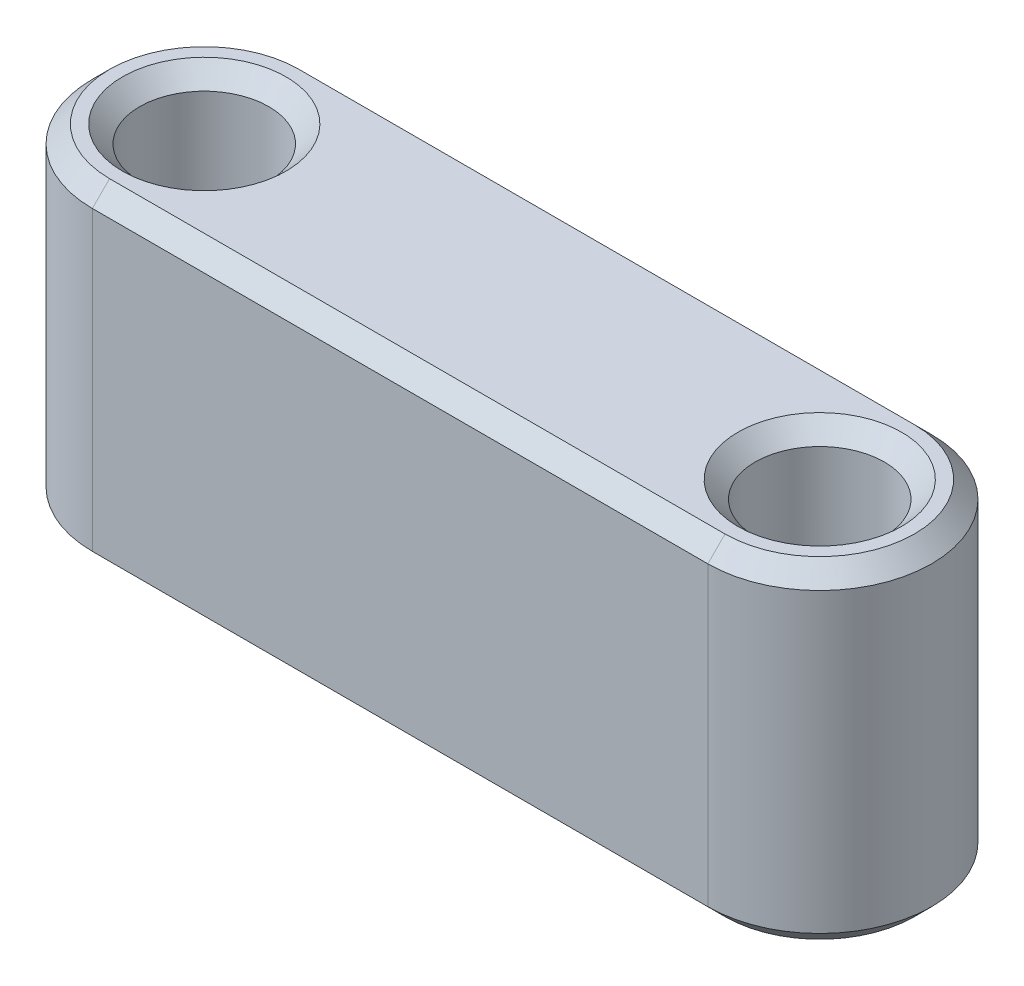
ISO-10303-21;
HEADER;
FILE_DESCRIPTION(('STEP AP214'),'2;1');
FILE_NAME('part.step','',(''),(''),'','','');
FILE_SCHEMA(('AUTOMOTIVE_DESIGN { 1 0 10303 214 1 1 1 1 }'));
ENDSEC;
DATA;
#1=APPLICATION_CONTEXT('core data for automotive mechanical design processes');
#2=APPLICATION_PROTOCOL_DEFINITION('international standard','automotive_design',2000,#1);
#3=PRODUCT_CONTEXT('',#1,'mechanical');
#4=PRODUCT('Part','Part','',(#3));
#5=PRODUCT_RELATED_PRODUCT_CATEGORY('part','',(#4));
#6=PRODUCT_DEFINITION_FORMATION('','',#4);
#7=PRODUCT_DEFINITION_CONTEXT('part definition',#1,'design');
#8=PRODUCT_DEFINITION('design','',#6,#7);
#9=PRODUCT_DEFINITION_SHAPE('','',#8);
#10=(LENGTH_UNIT() NAMED_UNIT(*) SI_UNIT(.MILLI.,.METRE.));
#11=(NAMED_UNIT(*) PLANE_ANGLE_UNIT() SI_UNIT($,.RADIAN.));
#12=(NAMED_UNIT(*) SI_UNIT($,.STERADIAN.) SOLID_ANGLE_UNIT());
#13=UNCERTAINTY_MEASURE_WITH_UNIT(LENGTH_MEASURE(1.E-05),#10,'distance_accuracy_value','');
#14=(GEOMETRIC_REPRESENTATION_CONTEXT(3) GLOBAL_UNCERTAINTY_ASSIGNED_CONTEXT((#13)) GLOBAL_UNIT_ASSIGNED_CONTEXT((#10,
#11,#12)) REPRESENTATION_CONTEXT('',''));
#15=CARTESIAN_POINT('',(0.,0.,0.));
#16=DIRECTION('',(0.,0.,1.));
#17=DIRECTION('',(1.,0.,0.));
#18=AXIS2_PLACEMENT_3D('',#15,#16,#17);
#19=CARTESIAN_POINT('',(-5.96361011368804,3.85,0.));
#20=DIRECTION('',(0.,1.,0.));
#21=DIRECTION('',(0.,0.,1.));
#22=AXIS2_PLACEMENT_3D('',#19,#20,#21);
#23=PLANE('',#22);
#24=CARTESIAN_POINT('',(8.33638988631196,3.85,0.));
#25=DIRECTION('',(0.,1.,0.));
#26=DIRECTION('',(0.,0.,1.));
#27=AXIS2_PLACEMENT_3D('',#24,#25,#26);
#28=CIRCLE('',#27,1.90000000000001);
#29=CARTESIAN_POINT('',(8.33638988631196,3.85,1.90000000000001));
#30=VERTEX_POINT('',#29);
#31=EDGE_CURVE('E11',#30,#30,#28,.F.);
#32=ORIENTED_EDGE('',*,*,#31,.T.);
#33=EDGE_LOOP('',(#32));
#34=FACE_BOUND('',#33,.T.);
#35=CARTESIAN_POINT('',(-5.96361011368804,3.85,0.));
#36=DIRECTION('',(0.,1.,0.));
#37=DIRECTION('',(0.,0.,1.));
#38=AXIS2_PLACEMENT_3D('',#35,#36,#37);
#39=CIRCLE('',#38,1.90000000000001);
#40=CARTESIAN_POINT('',(-5.96361011368804,3.85,1.90000000000001));
#41=VERTEX_POINT('',#40);
#42=EDGE_CURVE('E56',#41,#41,#39,.F.);
#43=ORIENTED_EDGE('',*,*,#42,.T.);
#44=EDGE_LOOP('',(#43));
#45=FACE_BOUND('',#44,.T.);
#46=DIRECTION('',(1.,0.,0.));
#47=VECTOR('',#46,1.);
#48=CARTESIAN_POINT('',(8.33638988631197,3.85,2.2));
#49=LINE('',#48,#47);
#50=CARTESIAN_POINT('',(-5.96361011368804,3.85,2.2));
#51=VERTEX_POINT('',#50);
#52=CARTESIAN_POINT('',(8.33638988631197,3.85,2.2));
#53=VERTEX_POINT('',#52);
#54=EDGE_CURVE('E64',#51,#53,#49,.T.);
#55=ORIENTED_EDGE('',*,*,#54,.T.);
#56=CARTESIAN_POINT('',(8.33638988631197,3.85,0.));
#57=DIRECTION('',(0.,1.,0.));
#58=DIRECTION('',(0.,0.,1.));
#59=AXIS2_PLACEMENT_3D('',#56,#57,#58);
#60=CIRCLE('',#59,2.2);
#61=CARTESIAN_POINT('',(8.33638988631197,3.85,-2.2));
#62=VERTEX_POINT('',#61);
#63=EDGE_CURVE('E181',#53,#62,#60,.T.);
#64=ORIENTED_EDGE('',*,*,#63,.T.);
#65=DIRECTION('',(-1.,0.,0.));
#66=VECTOR('',#65,1.);
#67=CARTESIAN_POINT('',(-5.96361011368804,3.85,-2.2));
#68=LINE('',#67,#66);
#69=CARTESIAN_POINT('',(-5.96361011368804,3.85,-2.2));
#70=VERTEX_POINT('',#69);
#71=EDGE_CURVE('E188',#62,#70,#68,.T.);
#72=ORIENTED_EDGE('',*,*,#71,.T.);
#73=CARTESIAN_POINT('',(-5.96361011368804,3.85,0.));
#74=DIRECTION('',(0.,1.,0.));
#75=DIRECTION('',(0.,0.,1.));
#76=AXIS2_PLACEMENT_3D('',#73,#74,#75);
#77=CIRCLE('',#76,2.2);
#78=EDGE_CURVE('E69',#70,#51,#77,.T.);
#79=ORIENTED_EDGE('',*,*,#78,.T.);
#80=EDGE_LOOP('',(#55,#64,#72,#79));
#81=FACE_BOUND('',#80,.T.);
#82=ADVANCED_FACE('F45',(#34,#45,#81),#23,.T.);
#83=CARTESIAN_POINT('',(-5.96361011368804,-3.85,0.));
#84=DIRECTION('',(0.,1.,0.));
#85=DIRECTION('',(0.,0.,1.));
#86=AXIS2_PLACEMENT_3D('',#83,#84,#85);
#87=PLANE('',#86);
#88=CARTESIAN_POINT('',(8.33638988631196,-3.85,0.));
#89=DIRECTION('',(0.,1.,0.));
#90=DIRECTION('',(0.,0.,1.));
#91=AXIS2_PLACEMENT_3D('',#88,#89,#90);
#92=CIRCLE('',#91,1.89999999999999);
#93=CARTESIAN_POINT('',(8.33638988631196,-3.85,1.89999999999999));
#94=VERTEX_POINT('',#93);
#95=EDGE_CURVE('E232',#94,#94,#92,.T.);
#96=ORIENTED_EDGE('',*,*,#95,.T.);
#97=EDGE_LOOP('',(#96));
#98=FACE_BOUND('',#97,.T.);
#99=CARTESIAN_POINT('',(-5.96361011368804,-3.85,0.));
#100=DIRECTION('',(0.,1.,0.));
#101=DIRECTION('',(0.,0.,1.));
#102=AXIS2_PLACEMENT_3D('',#99,#100,#101);
#103=CIRCLE('',#102,1.9);
#104=CARTESIAN_POINT('',(-5.96361011368804,-3.85,-1.9));
#105=VERTEX_POINT('',#104);
#106=EDGE_CURVE('E236',#105,#105,#103,.T.);
#107=ORIENTED_EDGE('',*,*,#106,.T.);
#108=EDGE_LOOP('',(#107));
#109=FACE_BOUND('',#108,.T.);
#110=CARTESIAN_POINT('',(8.33638988631197,-3.85,0.));
#111=DIRECTION('',(0.,1.,0.));
#112=DIRECTION('',(0.,0.,1.));
#113=AXIS2_PLACEMENT_3D('',#110,#111,#112);
#114=CIRCLE('',#113,2.2);
#115=CARTESIAN_POINT('',(8.33638988631197,-3.85,-2.2));
#116=VERTEX_POINT('',#115);
#117=CARTESIAN_POINT('',(8.33638988631197,-3.85,2.2));
#118=VERTEX_POINT('',#117);
#119=EDGE_CURVE('E125',#116,#118,#114,.F.);
#120=ORIENTED_EDGE('',*,*,#119,.T.);
#121=DIRECTION('',(-1.,0.,0.));
#122=VECTOR('',#121,1.);
#123=CARTESIAN_POINT('',(-5.96361011368804,-3.85,2.2));
#124=LINE('',#123,#122);
#125=CARTESIAN_POINT('',(-5.96361011368804,-3.85,2.2));
#126=VERTEX_POINT('',#125);
#127=EDGE_CURVE('E120',#118,#126,#124,.T.);
#128=ORIENTED_EDGE('',*,*,#127,.T.);
#129=CARTESIAN_POINT('',(-5.96361011368804,-3.85,0.));
#130=DIRECTION('',(0.,1.,0.));
#131=DIRECTION('',(0.,0.,1.));
#132=AXIS2_PLACEMENT_3D('',#129,#130,#131);
#133=CIRCLE('',#132,2.2);
#134=CARTESIAN_POINT('',(-5.96361011368804,-3.85,-2.2));
#135=VERTEX_POINT('',#134);
#136=EDGE_CURVE('E114',#126,#135,#133,.F.);
#137=ORIENTED_EDGE('',*,*,#136,.T.);
#138=DIRECTION('',(1.,0.,0.));
#139=VECTOR('',#138,1.);
#140=CARTESIAN_POINT('',(-5.96361011368804,-3.85,-2.2));
#141=LINE('',#140,#139);
#142=EDGE_CURVE('E117',#135,#116,#141,.T.);
#143=ORIENTED_EDGE('',*,*,#142,.T.);
#144=EDGE_LOOP('',(#120,#128,#137,#143));
#145=FACE_BOUND('',#144,.T.);
#146=ADVANCED_FACE('F116',(#98,#109,#145),#87,.F.);
#147=CARTESIAN_POINT('',(-5.96361011368804,3.85,0.));
#148=DIRECTION('',(0.,-1.,0.));
#149=DIRECTION('',(0.,0.,-1.));
#150=AXIS2_PLACEMENT_3D('',#147,#148,#149);
#151=CYLINDRICAL_SURFACE('',#150,2.6);
#152=DIRECTION('',(0.,-1.,0.));
#153=VECTOR('',#152,1.);
#154=CARTESIAN_POINT('',(-5.96361011368804,3.85,-2.6));
#155=LINE('',#154,#153);
#156=CARTESIAN_POINT('',(-5.96361011368804,3.45,-2.6));
#157=VERTEX_POINT('',#156);
#158=CARTESIAN_POINT('',(-5.96361011368804,-3.45,-2.6));
#159=VERTEX_POINT('',#158);
#160=EDGE_CURVE('E142',#157,#159,#155,.T.);
#161=ORIENTED_EDGE('',*,*,#160,.T.);
#162=CARTESIAN_POINT('',(-5.96361011368804,-3.45,0.));
#163=DIRECTION('',(0.,1.,0.));
#164=DIRECTION('',(0.,0.,1.));
#165=AXIS2_PLACEMENT_3D('',#162,#163,#164);
#166=CIRCLE('',#165,2.6);
#167=CARTESIAN_POINT('',(-5.96361011368804,-3.45,2.6));
#168=VERTEX_POINT('',#167);
#169=EDGE_CURVE('E140',#159,#168,#166,.T.);
#170=ORIENTED_EDGE('',*,*,#169,.T.);
#171=DIRECTION('',(0.,-1.,0.));
#172=VECTOR('',#171,1.);
#173=CARTESIAN_POINT('',(-5.96361011368804,3.85,2.6));
#174=LINE('',#173,#172);
#175=CARTESIAN_POINT('',(-5.96361011368804,3.45,2.6));
#176=VERTEX_POINT('',#175);
#177=EDGE_CURVE('E137',#176,#168,#174,.T.);
#178=ORIENTED_EDGE('',*,*,#177,.F.);
#179=CARTESIAN_POINT('',(-5.96361011368804,3.45,0.));
#180=DIRECTION('',(0.,1.,0.));
#181=DIRECTION('',(0.,0.,1.));
#182=AXIS2_PLACEMENT_3D('',#179,#180,#181);
#183=CIRCLE('',#182,2.6);
#184=EDGE_CURVE('E199',#176,#157,#183,.F.);
#185=ORIENTED_EDGE('',*,*,#184,.T.);
#186=EDGE_LOOP('',(#161,#170,#178,#185));
#187=FACE_BOUND('',#186,.T.);
#188=ADVANCED_FACE('F278',(#187),#151,.T.);
#189=CARTESIAN_POINT('',(-5.96361011368804,3.85,2.6));
#190=DIRECTION('',(0.,0.,-1.));
#191=DIRECTION('',(-1.,0.,0.));
#192=AXIS2_PLACEMENT_3D('',#189,#190,#191);
#193=PLANE('',#192);
#194=ORIENTED_EDGE('',*,*,#177,.T.);
#195=DIRECTION('',(1.,0.,0.));
#196=VECTOR('',#195,1.);
#197=CARTESIAN_POINT('',(-5.96361011368804,-3.45,2.6));
#198=LINE('',#197,#196);
#199=CARTESIAN_POINT('',(8.33638988631197,-3.45,2.6));
#200=VERTEX_POINT('',#199);
#201=EDGE_CURVE('E209',#168,#200,#198,.T.);
#202=ORIENTED_EDGE('',*,*,#201,.T.);
#203=DIRECTION('',(0.,-1.,0.));
#204=VECTOR('',#203,1.);
#205=CARTESIAN_POINT('',(8.33638988631197,3.85,2.6));
#206=LINE('',#205,#204);
#207=CARTESIAN_POINT('',(8.33638988631197,3.45,2.6));
#208=VERTEX_POINT('',#207);
#209=EDGE_CURVE('E247',#208,#200,#206,.T.);
#210=ORIENTED_EDGE('',*,*,#209,.F.);
#211=DIRECTION('',(-1.,0.,0.));
#212=VECTOR('',#211,1.);
#213=CARTESIAN_POINT('',(-5.96361011368804,3.45,2.6));
#214=LINE('',#213,#212);
#215=EDGE_CURVE('E213',#208,#176,#214,.T.);
#216=ORIENTED_EDGE('',*,*,#215,.T.);
#217=EDGE_LOOP('',(#194,#202,#210,#216));
#218=FACE_BOUND('',#217,.T.);
#219=ADVANCED_FACE('F264',(#218),#193,.F.);
#220=CARTESIAN_POINT('',(8.33638988631197,3.85,0.));
#221=DIRECTION('',(0.,-1.,0.));
#222=DIRECTION('',(0.,0.,-1.));
#223=AXIS2_PLACEMENT_3D('',#220,#221,#222);
#224=CYLINDRICAL_SURFACE('',#223,2.6);
#225=ORIENTED_EDGE('',*,*,#209,.T.);
#226=CARTESIAN_POINT('',(8.33638988631197,-3.45,0.));
#227=DIRECTION('',(0.,1.,0.));
#228=DIRECTION('',(0.,0.,1.));
#229=AXIS2_PLACEMENT_3D('',#226,#227,#228);
#230=CIRCLE('',#229,2.6);
#231=CARTESIAN_POINT('',(8.33638988631197,-3.45,-2.6));
#232=VERTEX_POINT('',#231);
#233=EDGE_CURVE('E202',#200,#232,#230,.T.);
#234=ORIENTED_EDGE('',*,*,#233,.T.);
#235=DIRECTION('',(0.,-1.,0.));
#236=VECTOR('',#235,1.);
#237=CARTESIAN_POINT('',(8.33638988631197,3.85,-2.6));
#238=LINE('',#237,#236);
#239=CARTESIAN_POINT('',(8.33638988631197,3.45,-2.6));
#240=VERTEX_POINT('',#239);
#241=EDGE_CURVE('E147',#240,#232,#238,.T.);
#242=ORIENTED_EDGE('',*,*,#241,.F.);
#243=CARTESIAN_POINT('',(8.33638988631197,3.45,0.));
#244=DIRECTION('',(0.,1.,0.));
#245=DIRECTION('',(0.,0.,1.));
#246=AXIS2_PLACEMENT_3D('',#243,#244,#245);
#247=CIRCLE('',#246,2.6);
#248=EDGE_CURVE('E205',#240,#208,#247,.F.);
#249=ORIENTED_EDGE('',*,*,#248,.T.);
#250=EDGE_LOOP('',(#225,#234,#242,#249));
#251=FACE_BOUND('',#250,.T.);
#252=ADVANCED_FACE('F266',(#251),#224,.T.);
#253=CARTESIAN_POINT('',(-5.96361011368804,3.85,-2.6));
#254=DIRECTION('',(0.,0.,1.));
#255=DIRECTION('',(1.,0.,0.));
#256=AXIS2_PLACEMENT_3D('',#253,#254,#255);
#257=PLANE('',#256);
#258=ORIENTED_EDGE('',*,*,#241,.T.);
#259=DIRECTION('',(-1.,0.,0.));
#260=VECTOR('',#259,1.);
#261=CARTESIAN_POINT('',(-5.96361011368804,-3.45,-2.6));
#262=LINE('',#261,#260);
#263=EDGE_CURVE('E191',#232,#159,#262,.T.);
#264=ORIENTED_EDGE('',*,*,#263,.T.);
#265=ORIENTED_EDGE('',*,*,#160,.F.);
#266=DIRECTION('',(1.,0.,0.));
#267=VECTOR('',#266,1.);
#268=CARTESIAN_POINT('',(8.33638988631197,3.45,-2.6));
#269=LINE('',#268,#267);
#270=EDGE_CURVE('E194',#157,#240,#269,.T.);
#271=ORIENTED_EDGE('',*,*,#270,.T.);
#272=EDGE_LOOP('',(#258,#264,#265,#271));
#273=FACE_BOUND('',#272,.T.);
#274=ADVANCED_FACE('F255',(#273),#257,.F.);
#275=CARTESIAN_POINT('',(-5.96361011368804,3.85,0.));
#276=DIRECTION('',(0.,-1.,0.));
#277=DIRECTION('',(0.,0.,-1.));
#278=AXIS2_PLACEMENT_3D('',#275,#276,#277);
#279=CYLINDRICAL_SURFACE('',#278,1.5);
#280=CARTESIAN_POINT('',(-5.96361011368804,-3.45,0.));
#281=DIRECTION('',(0.,1.,0.));
#282=DIRECTION('',(0.,0.,1.));
#283=AXIS2_PLACEMENT_3D('',#280,#281,#282);
#284=CIRCLE('',#283,1.5);
#285=CARTESIAN_POINT('',(-5.96361011368804,-3.45,-1.5));
#286=VERTEX_POINT('',#285);
#287=EDGE_CURVE('E216',#286,#286,#284,.F.);
#288=CARTESIAN_POINT('',(-5.96361011368804,3.44999999999999,0.));
#289=DIRECTION('',(0.,1.,0.));
#290=DIRECTION('',(0.,0.,1.));
#291=AXIS2_PLACEMENT_3D('',#288,#289,#290);
#292=CIRCLE('',#291,1.5);
#293=CARTESIAN_POINT('',(-5.96361011368804,3.44999999999999,-1.5));
#294=VERTEX_POINT('',#293);
#295=EDGE_CURVE('E220',#294,#294,#292,.T.);
#296=CARTESIAN_POINT('',(-5.96361011368804,-3.45,-1.5));
#297=CARTESIAN_POINT('',(-5.96361011368804,-3.378125,-1.5));
#298=CARTESIAN_POINT('',(-5.96361011368804,-3.30625,-1.5));
#299=CARTESIAN_POINT('',(-5.96361011368804,-3.1625,-1.5));
#300=CARTESIAN_POINT('',(-5.96361011368804,-3.090625,-1.5));
#301=CARTESIAN_POINT('',(-5.96361011368804,-2.946875,-1.5));
#302=CARTESIAN_POINT('',(-5.96361011368804,-2.875,-1.5));
#303=CARTESIAN_POINT('',(-5.96361011368804,-2.73125,-1.5));
#304=CARTESIAN_POINT('',(-5.96361011368804,-2.659375,-1.5));
#305=CARTESIAN_POINT('',(-5.96361011368804,-2.515625,-1.5));
#306=CARTESIAN_POINT('',(-5.96361011368804,-2.44375,-1.5));
#307=CARTESIAN_POINT('',(-5.96361011368804,-2.3,-1.5));
#308=CARTESIAN_POINT('',(-5.96361011368804,-2.228125,-1.5));
#309=CARTESIAN_POINT('',(-5.96361011368804,-2.084375,-1.5));
#310=CARTESIAN_POINT('',(-5.96361011368804,-2.0125,-1.5));
#311=CARTESIAN_POINT('',(-5.96361011368804,-1.86875,-1.5));
#312=CARTESIAN_POINT('',(-5.96361011368804,-1.796875,-1.5));
#313=CARTESIAN_POINT('',(-5.96361011368804,-1.653125,-1.5));
#314=CARTESIAN_POINT('',(-5.96361011368804,-1.58125,-1.5));
#315=CARTESIAN_POINT('',(-5.96361011368804,-1.4375,-1.5));
#316=CARTESIAN_POINT('',(-5.96361011368804,-1.365625,-1.5));
#317=CARTESIAN_POINT('',(-5.96361011368804,-1.221875,-1.5));
#318=CARTESIAN_POINT('',(-5.96361011368804,-1.15,-1.5));
#319=CARTESIAN_POINT('',(-5.96361011368804,-1.00625,-1.5));
#320=CARTESIAN_POINT('',(-5.96361011368804,-0.934375000000004,-1.5));
#321=CARTESIAN_POINT('',(-5.96361011368804,-0.790625000000004,-1.5));
#322=CARTESIAN_POINT('',(-5.96361011368804,-0.718750000000005,-1.5));
#323=CARTESIAN_POINT('',(-5.96361011368804,-0.575000000000005,-1.5));
#324=CARTESIAN_POINT('',(-5.96361011368804,-0.503125000000005,-1.5));
#325=CARTESIAN_POINT('',(-5.96361011368804,-0.359375000000005,-1.5));
#326=CARTESIAN_POINT('',(-5.96361011368804,-0.287500000000005,-1.5));
#327=CARTESIAN_POINT('',(-5.96361011368804,-0.143750000000005,-1.5));
#328=CARTESIAN_POINT('',(-5.96361011368804,-0.0718750000000054,-1.5));
#329=CARTESIAN_POINT('',(-5.96361011368804,0.0718749999999942,-1.5));
#330=CARTESIAN_POINT('',(-5.96361011368804,0.143749999999994,-1.5));
#331=CARTESIAN_POINT('',(-5.96361011368804,0.287499999999994,-1.5));
#332=CARTESIAN_POINT('',(-5.96361011368804,0.359374999999994,-1.5));
#333=CARTESIAN_POINT('',(-5.96361011368804,0.503124999999994,-1.5));
#334=CARTESIAN_POINT('',(-5.96361011368804,0.574999999999994,-1.5));
#335=CARTESIAN_POINT('',(-5.96361011368804,0.718749999999993,-1.5));
#336=CARTESIAN_POINT('',(-5.96361011368804,0.790624999999993,-1.5));
#337=CARTESIAN_POINT('',(-5.96361011368804,0.934374999999993,-1.5));
#338=CARTESIAN_POINT('',(-5.96361011368804,1.00624999999999,-1.5));
#339=CARTESIAN_POINT('',(-5.96361011368804,1.14999999999999,-1.5));
#340=CARTESIAN_POINT('',(-5.96361011368804,1.22187499999999,-1.5));
#341=CARTESIAN_POINT('',(-5.96361011368804,1.36562499999999,-1.5));
#342=CARTESIAN_POINT('',(-5.96361011368804,1.43749999999999,-1.5));
#343=CARTESIAN_POINT('',(-5.96361011368804,1.58124999999999,-1.5));
#344=CARTESIAN_POINT('',(-5.96361011368804,1.65312499999999,-1.5));
#345=CARTESIAN_POINT('',(-5.96361011368804,1.79687499999999,-1.5));
#346=CARTESIAN_POINT('',(-5.96361011368804,1.86874999999999,-1.5));
#347=CARTESIAN_POINT('',(-5.96361011368804,2.01249999999999,-1.5));
#348=CARTESIAN_POINT('',(-5.96361011368804,2.08437499999999,-1.5));
#349=CARTESIAN_POINT('',(-5.96361011368804,2.22812499999999,-1.5));
#350=CARTESIAN_POINT('',(-5.96361011368804,2.29999999999999,-1.5));
#351=CARTESIAN_POINT('',(-5.96361011368804,2.44374999999999,-1.5));
#352=CARTESIAN_POINT('',(-5.96361011368804,2.51562499999999,-1.5));
#353=CARTESIAN_POINT('',(-5.96361011368804,2.65937499999999,-1.5));
#354=CARTESIAN_POINT('',(-5.96361011368804,2.73124999999999,-1.5));
#355=CARTESIAN_POINT('',(-5.96361011368804,2.87499999999999,-1.5));
#356=CARTESIAN_POINT('',(-5.96361011368804,2.94687499999999,-1.5));
#357=CARTESIAN_POINT('',(-5.96361011368804,3.09062499999999,-1.5));
#358=CARTESIAN_POINT('',(-5.96361011368804,3.16249999999999,-1.5));
#359=CARTESIAN_POINT('',(-5.96361011368804,3.30624999999999,-1.5));
#360=CARTESIAN_POINT('',(-5.96361011368804,3.37812499999999,-1.5));
#361=CARTESIAN_POINT('',(-5.96361011368804,3.44999999999999,-1.5));
#362=B_SPLINE_CURVE_WITH_KNOTS('',3,(#296,#297,#298,#299,#300,#301,#302,#303,#304,#305,#306,
#307,#308,#309,#310,#311,#312,#313,#314,#315,#316,#317,#318,#319,#320,#321,#322,#323,#324,#325,
#326,#327,#328,#329,#330,#331,#332,#333,#334,#335,#336,#337,#338,#339,#340,#341,#342,#343,#344,
#345,#346,#347,#348,#349,#350,#351,#352,#353,#354,#355,#356,#357,#358,#359,#360,#361),
.UNSPECIFIED.,.F.,.F.,(4,2,2,2,2,2,2,2,2,2,2,2,2,2,2,2,2,2,2,2,2,2,2,2,2,2,2,2,2,2,2,2,4),(0.,
0.215625,0.431249999999999,0.646874999999999,0.862499999999999,1.078125,1.29375,1.509375,1.725,
1.940625,2.15625,2.371875,2.5875,2.803125,3.01875,3.234375,3.45,3.665625,3.88125,
4.09687499999999,4.31249999999999,4.52812499999999,4.74374999999999,4.95937499999999,
5.17499999999999,5.39062499999999,5.60624999999999,5.82187499999999,6.03749999999999,
6.25312499999999,6.46874999999999,6.68437499999999,6.89999999999999),.UNSPECIFIED.);
#363=EDGE_CURVE('BSEAM283',#286,#294,#362,.T.);
#364=ORIENTED_EDGE('',*,*,#287,.T.);
#365=ORIENTED_EDGE('',*,*,#295,.T.);
#366=ORIENTED_EDGE('',*,*,#363,.T.);
#367=ORIENTED_EDGE('',*,*,#363,.F.);
#368=EDGE_LOOP('',(#364,#366,#365,#367));
#369=FACE_BOUND('',#368,.T.);
#370=ADVANCED_FACE('F283',(#369),#279,.F.);
#371=CARTESIAN_POINT('',(8.33638988631196,3.85,0.));
#372=DIRECTION('',(0.,-1.,0.));
#373=DIRECTION('',(0.,0.,-1.));
#374=AXIS2_PLACEMENT_3D('',#371,#372,#373);
#375=CYLINDRICAL_SURFACE('',#374,1.5);
#376=CARTESIAN_POINT('',(8.33638988631196,-3.45000000000001,0.));
#377=DIRECTION('',(0.,1.,0.));
#378=DIRECTION('',(0.,0.,1.));
#379=AXIS2_PLACEMENT_3D('',#376,#377,#378);
#380=CIRCLE('',#379,1.5);
#381=CARTESIAN_POINT('',(8.33638988631196,-3.45000000000001,-1.5));
#382=VERTEX_POINT('',#381);
#383=EDGE_CURVE('E224',#382,#382,#380,.F.);
#384=CARTESIAN_POINT('',(8.33638988631196,3.44999999999999,0.));
#385=DIRECTION('',(0.,1.,0.));
#386=DIRECTION('',(0.,0.,1.));
#387=AXIS2_PLACEMENT_3D('',#384,#385,#386);
#388=CIRCLE('',#387,1.5);
#389=CARTESIAN_POINT('',(8.33638988631196,3.44999999999999,-1.5));
#390=VERTEX_POINT('',#389);
#391=EDGE_CURVE('E228',#390,#390,#388,.T.);
#392=CARTESIAN_POINT('',(8.33638988631196,-3.45000000000001,-1.5));
#393=CARTESIAN_POINT('',(8.33638988631196,-3.37812500000001,-1.5));
#394=CARTESIAN_POINT('',(8.33638988631196,-3.30625000000001,-1.5));
#395=CARTESIAN_POINT('',(8.33638988631196,-3.16250000000001,-1.5));
#396=CARTESIAN_POINT('',(8.33638988631196,-3.09062500000001,-1.5));
#397=CARTESIAN_POINT('',(8.33638988631196,-2.94687500000001,-1.5));
#398=CARTESIAN_POINT('',(8.33638988631196,-2.87500000000001,-1.5));
#399=CARTESIAN_POINT('',(8.33638988631196,-2.73125000000001,-1.5));
#400=CARTESIAN_POINT('',(8.33638988631196,-2.65937500000001,-1.5));
#401=CARTESIAN_POINT('',(8.33638988631196,-2.51562500000001,-1.5));
#402=CARTESIAN_POINT('',(8.33638988631196,-2.44375000000001,-1.5));
#403=CARTESIAN_POINT('',(8.33638988631196,-2.30000000000001,-1.5));
#404=CARTESIAN_POINT('',(8.33638988631196,-2.22812500000001,-1.5));
#405=CARTESIAN_POINT('',(8.33638988631196,-2.08437500000001,-1.5));
#406=CARTESIAN_POINT('',(8.33638988631196,-2.01250000000001,-1.5));
#407=CARTESIAN_POINT('',(8.33638988631196,-1.86875000000001,-1.5));
#408=CARTESIAN_POINT('',(8.33638988631196,-1.79687500000001,-1.5));
#409=CARTESIAN_POINT('',(8.33638988631196,-1.65312500000001,-1.5));
#410=CARTESIAN_POINT('',(8.33638988631196,-1.58125000000001,-1.5));
#411=CARTESIAN_POINT('',(8.33638988631196,-1.43750000000001,-1.5));
#412=CARTESIAN_POINT('',(8.33638988631196,-1.36562500000001,-1.5));
#413=CARTESIAN_POINT('',(8.33638988631196,-1.22187500000001,-1.5));
#414=CARTESIAN_POINT('',(8.33638988631196,-1.15000000000001,-1.5));
#415=CARTESIAN_POINT('',(8.33638988631196,-1.00625000000001,-1.5));
#416=CARTESIAN_POINT('',(8.33638988631196,-0.934375000000008,-1.5));
#417=CARTESIAN_POINT('',(8.33638988631196,-0.790625000000008,-1.5));
#418=CARTESIAN_POINT('',(8.33638988631196,-0.718750000000008,-1.5));
#419=CARTESIAN_POINT('',(8.33638988631196,-0.575000000000008,-1.5));
#420=CARTESIAN_POINT('',(8.33638988631196,-0.503125000000008,-1.5));
#421=CARTESIAN_POINT('',(8.33638988631196,-0.359375000000008,-1.5));
#422=CARTESIAN_POINT('',(8.33638988631196,-0.287500000000008,-1.5));
#423=CARTESIAN_POINT('',(8.33638988631196,-0.143750000000008,-1.5));
#424=CARTESIAN_POINT('',(8.33638988631196,-0.0718750000000086,-1.5));
#425=CARTESIAN_POINT('',(8.33638988631196,0.0718749999999914,-1.5));
#426=CARTESIAN_POINT('',(8.33638988631196,0.143749999999991,-1.5));
#427=CARTESIAN_POINT('',(8.33638988631196,0.287499999999991,-1.5));
#428=CARTESIAN_POINT('',(8.33638988631196,0.359374999999991,-1.5));
#429=CARTESIAN_POINT('',(8.33638988631196,0.503124999999991,-1.5));
#430=CARTESIAN_POINT('',(8.33638988631196,0.574999999999991,-1.5));
#431=CARTESIAN_POINT('',(8.33638988631196,0.718749999999991,-1.5));
#432=CARTESIAN_POINT('',(8.33638988631196,0.790624999999991,-1.5));
#433=CARTESIAN_POINT('',(8.33638988631196,0.934374999999991,-1.5));
#434=CARTESIAN_POINT('',(8.33638988631196,1.00624999999999,-1.5));
#435=CARTESIAN_POINT('',(8.33638988631196,1.14999999999999,-1.5));
#436=CARTESIAN_POINT('',(8.33638988631196,1.22187499999999,-1.5));
#437=CARTESIAN_POINT('',(8.33638988631196,1.36562499999999,-1.5));
#438=CARTESIAN_POINT('',(8.33638988631196,1.43749999999999,-1.5));
#439=CARTESIAN_POINT('',(8.33638988631196,1.58124999999999,-1.5));
#440=CARTESIAN_POINT('',(8.33638988631196,1.65312499999999,-1.5));
#441=CARTESIAN_POINT('',(8.33638988631196,1.79687499999999,-1.5));
#442=CARTESIAN_POINT('',(8.33638988631196,1.86874999999999,-1.5));
#443=CARTESIAN_POINT('',(8.33638988631196,2.01249999999999,-1.5));
#444=CARTESIAN_POINT('',(8.33638988631196,2.08437499999999,-1.5));
#445=CARTESIAN_POINT('',(8.33638988631196,2.22812499999999,-1.5));
#446=CARTESIAN_POINT('',(8.33638988631196,2.29999999999999,-1.5));
#447=CARTESIAN_POINT('',(8.33638988631196,2.44374999999999,-1.5));
#448=CARTESIAN_POINT('',(8.33638988631196,2.51562499999999,-1.5));
#449=CARTESIAN_POINT('',(8.33638988631196,2.65937499999999,-1.5));
#450=CARTESIAN_POINT('',(8.33638988631196,2.73124999999999,-1.5));
#451=CARTESIAN_POINT('',(8.33638988631196,2.87499999999999,-1.5));
#452=CARTESIAN_POINT('',(8.33638988631196,2.94687499999999,-1.5));
#453=CARTESIAN_POINT('',(8.33638988631196,3.09062499999999,-1.5));
#454=CARTESIAN_POINT('',(8.33638988631196,3.16249999999999,-1.5));
#455=CARTESIAN_POINT('',(8.33638988631196,3.30624999999999,-1.5));
#456=CARTESIAN_POINT('',(8.33638988631196,3.37812499999999,-1.5));
#457=CARTESIAN_POINT('',(8.33638988631196,3.44999999999999,-1.5));
#458=B_SPLINE_CURVE_WITH_KNOTS('',3,(#392,#393,#394,#395,#396,#397,#398,#399,#400,#401,#402,
#403,#404,#405,#406,#407,#408,#409,#410,#411,#412,#413,#414,#415,#416,#417,#418,#419,#420,#421,
#422,#423,#424,#425,#426,#427,#428,#429,#430,#431,#432,#433,#434,#435,#436,#437,#438,#439,#440,
#441,#442,#443,#444,#445,#446,#447,#448,#449,#450,#451,#452,#453,#454,#455,#456,#457),
.UNSPECIFIED.,.F.,.F.,(4,2,2,2,2,2,2,2,2,2,2,2,2,2,2,2,2,2,2,2,2,2,2,2,2,2,2,2,2,2,2,2,4),(0.,
0.215625,0.43125,0.646875,0.8625,1.078125,1.29375,1.509375,1.725,1.940625,2.15625,2.371875,
2.5875,2.803125,3.01875,3.234375,3.45,3.665625,3.88125,4.096875,4.3125,4.528125,4.74375,
4.959375,5.175,5.390625,5.60625,5.821875,6.0375,6.253125,6.46875,6.684375,6.9),.UNSPECIFIED.);
#459=EDGE_CURVE('BSEAM303',#382,#390,#458,.T.);
#460=ORIENTED_EDGE('',*,*,#383,.T.);
#461=ORIENTED_EDGE('',*,*,#391,.T.);
#462=ORIENTED_EDGE('',*,*,#459,.T.);
#463=ORIENTED_EDGE('',*,*,#459,.F.);
#464=EDGE_LOOP('',(#460,#462,#461,#463));
#465=FACE_BOUND('',#464,.T.);
#466=ADVANCED_FACE('F303',(#465),#375,.F.);
#467=CARTESIAN_POINT('',(8.33638988631196,-3.85,0.));
#468=DIRECTION('',(0.,-1.,0.));
#469=DIRECTION('',(0.,0.,-1.));
#470=AXIS2_PLACEMENT_3D('',#467,#468,#469);
#471=CONICAL_SURFACE('',#470,1.89999999999999,0.785398163397443);
#472=ORIENTED_EDGE('',*,*,#383,.F.);
#473=EDGE_LOOP('',(#472));
#474=FACE_BOUND('',#473,.T.);
#475=ORIENTED_EDGE('',*,*,#95,.F.);
#476=EDGE_LOOP('',(#475));
#477=FACE_BOUND('',#476,.T.);
#478=ADVANCED_FACE('F296',(#474,#477),#471,.F.);
#479=CARTESIAN_POINT('',(-5.96361011368804,-3.85,0.));
#480=DIRECTION('',(0.,-1.,0.));
#481=DIRECTION('',(0.,0.,-1.));
#482=AXIS2_PLACEMENT_3D('',#479,#480,#481);
#483=CONICAL_SURFACE('',#482,1.9,0.785398163397442);
#484=CARTESIAN_POINT('',(-5.96361011368804,-3.45,-1.5));
#485=CARTESIAN_POINT('',(-5.96361011368804,-3.45416666666667,-1.50416666666667));
#486=CARTESIAN_POINT('',(-5.96361011368804,-3.45833333333333,-1.50833333333333));
#487=CARTESIAN_POINT('',(-5.96361011368804,-3.46666666666667,-1.51666666666667));
#488=CARTESIAN_POINT('',(-5.96361011368804,-3.47083333333333,-1.52083333333333));
#489=CARTESIAN_POINT('',(-5.96361011368804,-3.47916666666667,-1.52916666666667));
#490=CARTESIAN_POINT('',(-5.96361011368804,-3.48333333333333,-1.53333333333333));
#491=CARTESIAN_POINT('',(-5.96361011368804,-3.49166666666667,-1.54166666666667));
#492=CARTESIAN_POINT('',(-5.96361011368804,-3.49583333333333,-1.54583333333333));
#493=CARTESIAN_POINT('',(-5.96361011368804,-3.50416666666667,-1.55416666666667));
#494=CARTESIAN_POINT('',(-5.96361011368804,-3.50833333333333,-1.55833333333333));
#495=CARTESIAN_POINT('',(-5.96361011368804,-3.51666666666667,-1.56666666666667));
#496=CARTESIAN_POINT('',(-5.96361011368804,-3.52083333333333,-1.57083333333333));
#497=CARTESIAN_POINT('',(-5.96361011368804,-3.52916666666667,-1.57916666666667));
#498=CARTESIAN_POINT('',(-5.96361011368804,-3.53333333333333,-1.58333333333333));
#499=CARTESIAN_POINT('',(-5.96361011368804,-3.54166666666667,-1.59166666666667));
#500=CARTESIAN_POINT('',(-5.96361011368804,-3.54583333333333,-1.59583333333333));
#501=CARTESIAN_POINT('',(-5.96361011368804,-3.55416666666667,-1.60416666666667));
#502=CARTESIAN_POINT('',(-5.96361011368804,-3.55833333333333,-1.60833333333333));
#503=CARTESIAN_POINT('',(-5.96361011368804,-3.56666666666667,-1.61666666666667));
#504=CARTESIAN_POINT('',(-5.96361011368804,-3.57083333333333,-1.62083333333333));
#505=CARTESIAN_POINT('',(-5.96361011368804,-3.57916666666667,-1.62916666666667));
#506=CARTESIAN_POINT('',(-5.96361011368804,-3.58333333333333,-1.63333333333333));
#507=CARTESIAN_POINT('',(-5.96361011368804,-3.59166666666667,-1.64166666666667));
#508=CARTESIAN_POINT('',(-5.96361011368804,-3.59583333333333,-1.64583333333333));
#509=CARTESIAN_POINT('',(-5.96361011368804,-3.60416666666667,-1.65416666666667));
#510=CARTESIAN_POINT('',(-5.96361011368804,-3.60833333333333,-1.65833333333333));
#511=CARTESIAN_POINT('',(-5.96361011368804,-3.61666666666667,-1.66666666666667));
#512=CARTESIAN_POINT('',(-5.96361011368804,-3.62083333333333,-1.67083333333333));
#513=CARTESIAN_POINT('',(-5.96361011368804,-3.62916666666667,-1.67916666666667));
#514=CARTESIAN_POINT('',(-5.96361011368804,-3.63333333333333,-1.68333333333333));
#515=CARTESIAN_POINT('',(-5.96361011368804,-3.64166666666667,-1.69166666666666));
#516=CARTESIAN_POINT('',(-5.96361011368804,-3.64583333333333,-1.69583333333333));
#517=CARTESIAN_POINT('',(-5.96361011368804,-3.65416666666667,-1.70416666666666));
#518=CARTESIAN_POINT('',(-5.96361011368804,-3.65833333333333,-1.70833333333333));
#519=CARTESIAN_POINT('',(-5.96361011368804,-3.66666666666667,-1.71666666666666));
#520=CARTESIAN_POINT('',(-5.96361011368804,-3.67083333333333,-1.72083333333333));
#521=CARTESIAN_POINT('',(-5.96361011368804,-3.67916666666667,-1.72916666666666));
#522=CARTESIAN_POINT('',(-5.96361011368804,-3.68333333333333,-1.73333333333333));
#523=CARTESIAN_POINT('',(-5.96361011368804,-3.69166666666667,-1.74166666666666));
#524=CARTESIAN_POINT('',(-5.96361011368804,-3.69583333333333,-1.74583333333333));
#525=CARTESIAN_POINT('',(-5.96361011368804,-3.70416666666667,-1.75416666666666));
#526=CARTESIAN_POINT('',(-5.96361011368804,-3.70833333333333,-1.75833333333333));
#527=CARTESIAN_POINT('',(-5.96361011368804,-3.71666666666667,-1.76666666666666));
#528=CARTESIAN_POINT('',(-5.96361011368804,-3.72083333333333,-1.77083333333333));
#529=CARTESIAN_POINT('',(-5.96361011368804,-3.72916666666667,-1.77916666666666));
#530=CARTESIAN_POINT('',(-5.96361011368804,-3.73333333333333,-1.78333333333333));
#531=CARTESIAN_POINT('',(-5.96361011368804,-3.74166666666667,-1.79166666666666));
#532=CARTESIAN_POINT('',(-5.96361011368804,-3.74583333333333,-1.79583333333333));
#533=CARTESIAN_POINT('',(-5.96361011368804,-3.75416666666667,-1.80416666666666));
#534=CARTESIAN_POINT('',(-5.96361011368804,-3.75833333333333,-1.80833333333333));
#535=CARTESIAN_POINT('',(-5.96361011368804,-3.76666666666667,-1.81666666666666));
#536=CARTESIAN_POINT('',(-5.96361011368804,-3.77083333333333,-1.82083333333333));
#537=CARTESIAN_POINT('',(-5.96361011368804,-3.77916666666667,-1.82916666666666));
#538=CARTESIAN_POINT('',(-5.96361011368804,-3.78333333333333,-1.83333333333333));
#539=CARTESIAN_POINT('',(-5.96361011368804,-3.79166666666667,-1.84166666666666));
#540=CARTESIAN_POINT('',(-5.96361011368804,-3.79583333333333,-1.84583333333333));
#541=CARTESIAN_POINT('',(-5.96361011368804,-3.80416666666667,-1.85416666666666));
#542=CARTESIAN_POINT('',(-5.96361011368804,-3.80833333333333,-1.85833333333333));
#543=CARTESIAN_POINT('',(-5.96361011368804,-3.81666666666667,-1.86666666666666));
#544=CARTESIAN_POINT('',(-5.96361011368804,-3.82083333333333,-1.87083333333333));
#545=CARTESIAN_POINT('',(-5.96361011368804,-3.82916666666667,-1.87916666666666));
#546=CARTESIAN_POINT('',(-5.96361011368804,-3.83333333333333,-1.88333333333333));
#547=CARTESIAN_POINT('',(-5.96361011368804,-3.84166666666667,-1.89166666666666));
#548=CARTESIAN_POINT('',(-5.96361011368804,-3.84583333333333,-1.89583333333333));
#549=CARTESIAN_POINT('',(-5.96361011368804,-3.85,-1.9));
#550=B_SPLINE_CURVE_WITH_KNOTS('',3,(#484,#485,#486,#487,#488,#489,#490,#491,#492,#493,#494,
#495,#496,#497,#498,#499,#500,#501,#502,#503,#504,#505,#506,#507,#508,#509,#510,#511,#512,#513,
#514,#515,#516,#517,#518,#519,#520,#521,#522,#523,#524,#525,#526,#527,#528,#529,#530,#531,#532,
#533,#534,#535,#536,#537,#538,#539,#540,#541,#542,#543,#544,#545,#546,#547,#548,#549),
.UNSPECIFIED.,.F.,.F.,(4,2,2,2,2,2,2,2,2,2,2,2,2,2,2,2,2,2,2,2,2,2,2,2,2,2,2,2,2,2,2,2,4),(0.,
0.0176776695296636,0.035355339059327,0.0530330085889904,0.070710678118654,0.0883883476483176,
0.106066017177981,0.123743686707645,0.141421356237308,0.159099025766972,0.176776695296636,
0.194454364826299,0.212132034355963,0.229809703885626,0.24748737341529,0.265165042944953,
0.282842712474617,0.30052038200428,0.318198051533944,0.335875721063608,0.353553390593271,
0.371231060122935,0.388908729652598,0.406586399182262,0.424264068711925,0.441941738241589,
0.459619407771252,0.477297077300916,0.49497474683058,0.512652416360243,0.530330085889906,
0.54800775541957,0.565685424949233),.UNSPECIFIED.);
#551=EDGE_CURVE('BSEAM302',#286,#105,#550,.T.);
#552=ORIENTED_EDGE('',*,*,#287,.F.);
#553=ORIENTED_EDGE('',*,*,#106,.F.);
#554=ORIENTED_EDGE('',*,*,#551,.T.);
#555=ORIENTED_EDGE('',*,*,#551,.F.);
#556=EDGE_LOOP('',(#552,#554,#553,#555));
#557=FACE_BOUND('',#556,.T.);
#558=ADVANCED_FACE('F302',(#557),#483,.F.);
#559=CARTESIAN_POINT('',(-5.96361011368804,-3.45,-2.6));
#560=DIRECTION('',(0.,0.707106781186552,0.707106781186543));
#561=DIRECTION('',(-1.,0.,0.));
#562=AXIS2_PLACEMENT_3D('',#559,#560,#561);
#563=PLANE('',#562);
#564=DIRECTION('',(0.,0.707106781186543,-0.707106781186552));
#565=VECTOR('',#564,1.);
#566=CARTESIAN_POINT('',(8.33638988631197,-3.85,-2.2));
#567=LINE('',#566,#565);
#568=EDGE_CURVE('E134',#116,#232,#567,.T.);
#569=ORIENTED_EDGE('',*,*,#568,.F.);
#570=ORIENTED_EDGE('',*,*,#142,.F.);
#571=DIRECTION('',(0.,-0.707106781186543,0.707106781186552));
#572=VECTOR('',#571,1.);
#573=CARTESIAN_POINT('',(-5.96361011368804,-3.45,-2.6));
#574=LINE('',#573,#572);
#575=EDGE_CURVE('E131',#159,#135,#574,.T.);
#576=ORIENTED_EDGE('',*,*,#575,.F.);
#577=ORIENTED_EDGE('',*,*,#263,.F.);
#578=EDGE_LOOP('',(#569,#570,#576,#577));
#579=FACE_BOUND('',#578,.T.);
#580=ADVANCED_FACE('F129',(#579),#563,.F.);
#581=CARTESIAN_POINT('',(-5.96361011368804,-3.45,0.));
#582=DIRECTION('',(0.,1.,0.));
#583=DIRECTION('',(0.,0.,1.));
#584=AXIS2_PLACEMENT_3D('',#581,#582,#583);
#585=CONICAL_SURFACE('',#584,2.6,0.785398163397455);
#586=ORIENTED_EDGE('',*,*,#575,.T.);
#587=ORIENTED_EDGE('',*,*,#136,.F.);
#588=DIRECTION('',(0.,-0.707106781186543,-0.707106781186552));
#589=VECTOR('',#588,1.);
#590=CARTESIAN_POINT('',(-5.96361011368804,-3.45,2.6));
#591=LINE('',#590,#589);
#592=EDGE_CURVE('E149',#168,#126,#591,.T.);
#593=ORIENTED_EDGE('',*,*,#592,.F.);
#594=ORIENTED_EDGE('',*,*,#169,.F.);
#595=EDGE_LOOP('',(#586,#587,#593,#594));
#596=FACE_BOUND('',#595,.T.);
#597=ADVANCED_FACE('F139',(#596),#585,.T.);
#598=CARTESIAN_POINT('',(8.33638988631197,-3.45,0.));
#599=DIRECTION('',(0.,1.,0.));
#600=DIRECTION('',(0.,0.,1.));
#601=AXIS2_PLACEMENT_3D('',#598,#599,#600);
#602=CONICAL_SURFACE('',#601,2.6,0.785398163397455);
#603=ORIENTED_EDGE('',*,*,#568,.T.);
#604=ORIENTED_EDGE('',*,*,#233,.F.);
#605=DIRECTION('',(0.,0.707106781186543,0.707106781186552));
#606=VECTOR('',#605,1.);
#607=CARTESIAN_POINT('',(8.33638988631197,-3.85,2.2));
#608=LINE('',#607,#606);
#609=EDGE_CURVE('E167',#118,#200,#608,.T.);
#610=ORIENTED_EDGE('',*,*,#609,.F.);
#611=ORIENTED_EDGE('',*,*,#119,.F.);
#612=EDGE_LOOP('',(#603,#604,#610,#611));
#613=FACE_BOUND('',#612,.T.);
#614=ADVANCED_FACE('F260',(#613),#602,.T.);
#615=CARTESIAN_POINT('',(-5.96361011368804,-3.45,2.6));
#616=DIRECTION('',(0.,0.707106781186552,-0.707106781186543));
#617=DIRECTION('',(1.,0.,0.));
#618=AXIS2_PLACEMENT_3D('',#615,#616,#617);
#619=PLANE('',#618);
#620=ORIENTED_EDGE('',*,*,#592,.T.);
#621=ORIENTED_EDGE('',*,*,#127,.F.);
#622=ORIENTED_EDGE('',*,*,#609,.T.);
#623=ORIENTED_EDGE('',*,*,#201,.F.);
#624=EDGE_LOOP('',(#620,#621,#622,#623));
#625=FACE_BOUND('',#624,.T.);
#626=ADVANCED_FACE('F261',(#625),#619,.F.);
#627=CARTESIAN_POINT('',(8.33638988631196,3.44999999999999,0.));
#628=DIRECTION('',(0.,1.,0.));
#629=DIRECTION('',(0.,0.,1.));
#630=AXIS2_PLACEMENT_3D('',#627,#628,#629);
#631=CONICAL_SURFACE('',#630,1.5,0.785398163397453);
#632=ORIENTED_EDGE('',*,*,#31,.F.);
#633=EDGE_LOOP('',(#632));
#634=FACE_BOUND('',#633,.T.);
#635=ORIENTED_EDGE('',*,*,#391,.F.);
#636=EDGE_LOOP('',(#635));
#637=FACE_BOUND('',#636,.T.);
#638=ADVANCED_FACE('F318',(#634,#637),#631,.F.);
#639=CARTESIAN_POINT('',(-5.96361011368804,3.44999999999999,0.));
#640=DIRECTION('',(0.,1.,0.));
#641=DIRECTION('',(0.,0.,1.));
#642=AXIS2_PLACEMENT_3D('',#639,#640,#641);
#643=CONICAL_SURFACE('',#642,1.5,0.785398163397453);
#644=ORIENTED_EDGE('',*,*,#42,.F.);
#645=EDGE_LOOP('',(#644));
#646=FACE_BOUND('',#645,.T.);
#647=ORIENTED_EDGE('',*,*,#295,.F.);
#648=EDGE_LOOP('',(#647));
#649=FACE_BOUND('',#648,.T.);
#650=ADVANCED_FACE('F337',(#646,#649),#643,.F.);
#651=CARTESIAN_POINT('',(-5.96361011368804,3.85,0.));
#652=DIRECTION('',(0.,-1.,0.));
#653=DIRECTION('',(0.,0.,-1.));
#654=AXIS2_PLACEMENT_3D('',#651,#652,#653);
#655=CONICAL_SURFACE('',#654,2.2,0.785398163397444);
#656=DIRECTION('',(0.,0.707106781186551,0.707106781186545));
#657=VECTOR('',#656,1.);
#658=CARTESIAN_POINT('',(-5.96361011368804,3.45,-2.6));
#659=LINE('',#658,#657);
#660=EDGE_CURVE('E158',#157,#70,#659,.T.);
#661=ORIENTED_EDGE('',*,*,#660,.F.);
#662=ORIENTED_EDGE('',*,*,#184,.F.);
#663=DIRECTION('',(0.,-0.707106781186551,0.707106781186545));
#664=VECTOR('',#663,1.);
#665=CARTESIAN_POINT('',(-5.96361011368804,3.85,2.2));
#666=LINE('',#665,#664);
#667=EDGE_CURVE('E50',#51,#176,#666,.T.);
#668=ORIENTED_EDGE('',*,*,#667,.F.);
#669=ORIENTED_EDGE('',*,*,#78,.F.);
#670=EDGE_LOOP('',(#661,#662,#668,#669));
#671=FACE_BOUND('',#670,.T.);
#672=ADVANCED_FACE('F48',(#671),#655,.T.);
#673=CARTESIAN_POINT('',(-5.96361011368804,3.85,2.2));
#674=DIRECTION('',(0.,0.707106781186545,0.707106781186551));
#675=DIRECTION('',(-1.,0.,0.));
#676=AXIS2_PLACEMENT_3D('',#673,#674,#675);
#677=PLANE('',#676);
#678=ORIENTED_EDGE('',*,*,#667,.T.);
#679=ORIENTED_EDGE('',*,*,#215,.F.);
#680=DIRECTION('',(0.,-0.707106781186551,0.707106781186545));
#681=VECTOR('',#680,1.);
#682=CARTESIAN_POINT('',(8.33638988631197,3.85,2.2));
#683=LINE('',#682,#681);
#684=EDGE_CURVE('E156',#53,#208,#683,.T.);
#685=ORIENTED_EDGE('',*,*,#684,.F.);
#686=ORIENTED_EDGE('',*,*,#54,.F.);
#687=EDGE_LOOP('',(#678,#679,#685,#686));
#688=FACE_BOUND('',#687,.T.);
#689=ADVANCED_FACE('F354',(#688),#677,.T.);
#690=CARTESIAN_POINT('',(-5.96361011368804,3.85,-2.2));
#691=DIRECTION('',(0.,0.707106781186545,-0.707106781186551));
#692=DIRECTION('',(1.,0.,0.));
#693=AXIS2_PLACEMENT_3D('',#690,#691,#692);
#694=PLANE('',#693);
#695=ORIENTED_EDGE('',*,*,#660,.T.);
#696=ORIENTED_EDGE('',*,*,#71,.F.);
#697=DIRECTION('',(0.,0.707106781186551,0.707106781186545));
#698=VECTOR('',#697,1.);
#699=CARTESIAN_POINT('',(8.33638988631197,3.45,-2.6));
#700=LINE('',#699,#698);
#701=EDGE_CURVE('E153',#240,#62,#700,.T.);
#702=ORIENTED_EDGE('',*,*,#701,.F.);
#703=ORIENTED_EDGE('',*,*,#270,.F.);
#704=EDGE_LOOP('',(#695,#696,#702,#703));
#705=FACE_BOUND('',#704,.T.);
#706=ADVANCED_FACE('F271',(#705),#694,.T.);
#707=CARTESIAN_POINT('',(8.33638988631197,3.85,0.));
#708=DIRECTION('',(0.,-1.,0.));
#709=DIRECTION('',(0.,0.,-1.));
#710=AXIS2_PLACEMENT_3D('',#707,#708,#709);
#711=CONICAL_SURFACE('',#710,2.2,0.785398163397444);
#712=ORIENTED_EDGE('',*,*,#684,.T.);
#713=ORIENTED_EDGE('',*,*,#248,.F.);
#714=ORIENTED_EDGE('',*,*,#701,.T.);
#715=ORIENTED_EDGE('',*,*,#63,.F.);
#716=EDGE_LOOP('',(#712,#713,#714,#715));
#717=FACE_BOUND('',#716,.T.);
#718=ADVANCED_FACE('F269',(#717),#711,.T.);
#719=CLOSED_SHELL('',(#82,#146,#188,#219,#252,#274,#370,#466,#478,#558,#580,#597,#614,#626,#638,
#650,#672,#689,#706,#718));
#720=MANIFOLD_SOLID_BREP('B2',#719);
#721=ADVANCED_BREP_SHAPE_REPRESENTATION('',(#18,#720),#14);
#722=SHAPE_DEFINITION_REPRESENTATION(#9,#721);
ENDSEC;
END-ISO-10303-21;
